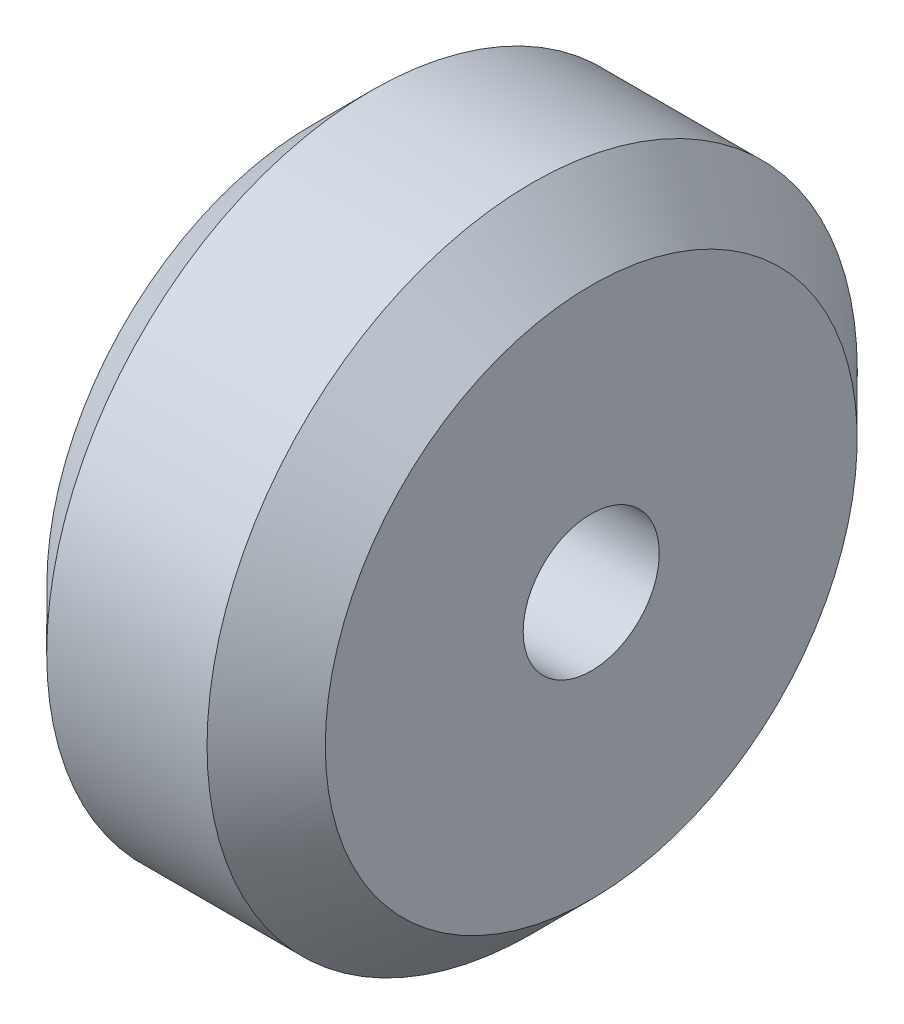
ISO-10303-21;
HEADER;
FILE_DESCRIPTION(('STEP AP214'),'2;1');
FILE_NAME('part.step','',(''),(''),'','','');
FILE_SCHEMA(('AUTOMOTIVE_DESIGN { 1 0 10303 214 1 1 1 1 }'));
ENDSEC;
DATA;
#1=APPLICATION_CONTEXT('core data for automotive mechanical design processes');
#2=APPLICATION_PROTOCOL_DEFINITION('international standard','automotive_design',2000,#1);
#3=PRODUCT_CONTEXT('',#1,'mechanical');
#4=PRODUCT('Part','Part','',(#3));
#5=PRODUCT_RELATED_PRODUCT_CATEGORY('part','',(#4));
#6=PRODUCT_DEFINITION_FORMATION('','',#4);
#7=PRODUCT_DEFINITION_CONTEXT('part definition',#1,'design');
#8=PRODUCT_DEFINITION('design','',#6,#7);
#9=PRODUCT_DEFINITION_SHAPE('','',#8);
#10=(LENGTH_UNIT() NAMED_UNIT(*) SI_UNIT(.MILLI.,.METRE.));
#11=(NAMED_UNIT(*) PLANE_ANGLE_UNIT() SI_UNIT($,.RADIAN.));
#12=(NAMED_UNIT(*) SI_UNIT($,.STERADIAN.) SOLID_ANGLE_UNIT());
#13=UNCERTAINTY_MEASURE_WITH_UNIT(LENGTH_MEASURE(1.E-05),#10,'distance_accuracy_value','');
#14=(GEOMETRIC_REPRESENTATION_CONTEXT(3) GLOBAL_UNCERTAINTY_ASSIGNED_CONTEXT((#13)) GLOBAL_UNIT_ASSIGNED_CONTEXT((#10,
#11,#12)) REPRESENTATION_CONTEXT('',''));
#15=CARTESIAN_POINT('',(0.,0.,0.));
#16=DIRECTION('',(0.,0.,1.));
#17=DIRECTION('',(1.,0.,0.));
#18=AXIS2_PLACEMENT_3D('',#15,#16,#17);
#19=CARTESIAN_POINT('',(10.23,0.,0.));
#20=DIRECTION('',(-1.,0.,0.));
#21=DIRECTION('',(0.,0.,1.));
#22=AXIS2_PLACEMENT_3D('',#19,#20,#21);
#23=CONICAL_SURFACE('',#22,9.77,0.786548910875691);
#24=CARTESIAN_POINT('',(8.06,0.,0.));
#25=DIRECTION('',(-1.,0.,0.));
#26=DIRECTION('',(0.,0.,1.));
#27=AXIS2_PLACEMENT_3D('',#24,#25,#26);
#28=CIRCLE('',#27,11.945);
#29=CARTESIAN_POINT('',(8.06,0.,11.945));
#30=VERTEX_POINT('',#29);
#31=EDGE_CURVE('E10',#30,#30,#28,.T.);
#32=ORIENTED_EDGE('',*,*,#31,.F.);
#33=EDGE_LOOP('',(#32));
#34=FACE_BOUND('',#33,.T.);
#35=CARTESIAN_POINT('',(10.23,0.,0.));
#36=DIRECTION('',(-1.,0.,0.));
#37=DIRECTION('',(0.,0.,1.));
#38=AXIS2_PLACEMENT_3D('',#35,#36,#37);
#39=CIRCLE('',#38,9.77);
#40=CARTESIAN_POINT('',(10.23,0.,9.77));
#41=VERTEX_POINT('',#40);
#42=EDGE_CURVE('E68',#41,#41,#39,.T.);
#43=ORIENTED_EDGE('',*,*,#42,.T.);
#44=EDGE_LOOP('',(#43));
#45=FACE_BOUND('',#44,.T.);
#46=ADVANCED_FACE('F39',(#34,#45),#23,.T.);
#47=CARTESIAN_POINT('',(0.,0.,0.));
#48=DIRECTION('',(-1.,0.,0.));
#49=DIRECTION('',(0.,0.,1.));
#50=AXIS2_PLACEMENT_3D('',#47,#48,#49);
#51=CYLINDRICAL_SURFACE('',#50,11.945);
#52=CARTESIAN_POINT('',(2.17,0.,0.));
#53=DIRECTION('',(-1.,0.,0.));
#54=DIRECTION('',(0.,0.,1.));
#55=AXIS2_PLACEMENT_3D('',#52,#53,#54);
#56=CIRCLE('',#55,11.945);
#57=CARTESIAN_POINT('',(2.17,0.,11.945));
#58=VERTEX_POINT('',#57);
#59=EDGE_CURVE('E46',#58,#58,#56,.T.);
#60=ORIENTED_EDGE('',*,*,#59,.F.);
#61=EDGE_LOOP('',(#60));
#62=FACE_BOUND('',#61,.T.);
#63=ORIENTED_EDGE('',*,*,#31,.T.);
#64=EDGE_LOOP('',(#63));
#65=FACE_BOUND('',#64,.T.);
#66=ADVANCED_FACE('F95',(#62,#65),#51,.T.);
#67=CARTESIAN_POINT('',(2.17,0.,0.));
#68=DIRECTION('',(1.,0.,0.));
#69=DIRECTION('',(0.,0.,-1.));
#70=AXIS2_PLACEMENT_3D('',#67,#68,#69);
#71=CONICAL_SURFACE('',#70,11.945,0.786548910875692);
#72=CARTESIAN_POINT('',(0.,0.,0.));
#73=DIRECTION('',(-1.,0.,0.));
#74=DIRECTION('',(0.,0.,1.));
#75=AXIS2_PLACEMENT_3D('',#72,#73,#74);
#76=CIRCLE('',#75,9.77);
#77=CARTESIAN_POINT('',(0.,0.,9.77));
#78=VERTEX_POINT('',#77);
#79=EDGE_CURVE('E53',#78,#78,#76,.T.);
#80=ORIENTED_EDGE('',*,*,#79,.F.);
#81=EDGE_LOOP('',(#80));
#82=FACE_BOUND('',#81,.T.);
#83=ORIENTED_EDGE('',*,*,#59,.T.);
#84=EDGE_LOOP('',(#83));
#85=FACE_BOUND('',#84,.T.);
#86=ADVANCED_FACE('F90',(#82,#85),#71,.T.);
#87=CARTESIAN_POINT('',(0.,9.77,0.));
#88=DIRECTION('',(1.,0.,0.));
#89=DIRECTION('',(0.,0.,-1.));
#90=AXIS2_PLACEMENT_3D('',#87,#88,#89);
#91=PLANE('',#90);
#92=CARTESIAN_POINT('',(0.,0.,0.));
#93=DIRECTION('',(-1.,0.,0.));
#94=DIRECTION('',(0.,0.,1.));
#95=AXIS2_PLACEMENT_3D('',#92,#93,#94);
#96=CIRCLE('',#95,2.5);
#97=CARTESIAN_POINT('',(0.,0.,2.5));
#98=VERTEX_POINT('',#97);
#99=EDGE_CURVE('E60',#98,#98,#96,.T.);
#100=ORIENTED_EDGE('',*,*,#99,.F.);
#101=EDGE_LOOP('',(#100));
#102=FACE_BOUND('',#101,.T.);
#103=ORIENTED_EDGE('',*,*,#79,.T.);
#104=EDGE_LOOP('',(#103));
#105=FACE_BOUND('',#104,.T.);
#106=ADVANCED_FACE('F84',(#102,#105),#91,.F.);
#107=CARTESIAN_POINT('',(0.,0.,0.));
#108=DIRECTION('',(-1.,0.,0.));
#109=DIRECTION('',(0.,0.,1.));
#110=AXIS2_PLACEMENT_3D('',#107,#108,#109);
#111=CYLINDRICAL_SURFACE('',#110,2.5);
#112=CARTESIAN_POINT('',(10.23,0.,0.));
#113=DIRECTION('',(-1.,0.,0.));
#114=DIRECTION('',(0.,0.,1.));
#115=AXIS2_PLACEMENT_3D('',#112,#113,#114);
#116=CIRCLE('',#115,2.5);
#117=CARTESIAN_POINT('',(10.23,0.,2.5));
#118=VERTEX_POINT('',#117);
#119=EDGE_CURVE('E65',#118,#118,#116,.T.);
#120=ORIENTED_EDGE('',*,*,#119,.F.);
#121=EDGE_LOOP('',(#120));
#122=FACE_BOUND('',#121,.T.);
#123=ORIENTED_EDGE('',*,*,#99,.T.);
#124=EDGE_LOOP('',(#123));
#125=FACE_BOUND('',#124,.T.);
#126=ADVANCED_FACE('F78',(#122,#125),#111,.F.);
#127=CARTESIAN_POINT('',(10.23,2.5,0.));
#128=DIRECTION('',(-1.,0.,0.));
#129=DIRECTION('',(0.,0.,1.));
#130=AXIS2_PLACEMENT_3D('',#127,#128,#129);
#131=PLANE('',#130);
#132=ORIENTED_EDGE('',*,*,#42,.F.);
#133=EDGE_LOOP('',(#132));
#134=FACE_BOUND('',#133,.T.);
#135=ORIENTED_EDGE('',*,*,#119,.T.);
#136=EDGE_LOOP('',(#135));
#137=FACE_BOUND('',#136,.T.);
#138=ADVANCED_FACE('F75',(#134,#137),#131,.F.);
#139=CLOSED_SHELL('',(#46,#66,#86,#106,#126,#138));
#140=MANIFOLD_SOLID_BREP('B2',#139);
#141=ADVANCED_BREP_SHAPE_REPRESENTATION('',(#18,#140),#14);
#142=SHAPE_DEFINITION_REPRESENTATION(#9,#141);
ENDSEC;
END-ISO-10303-21;
